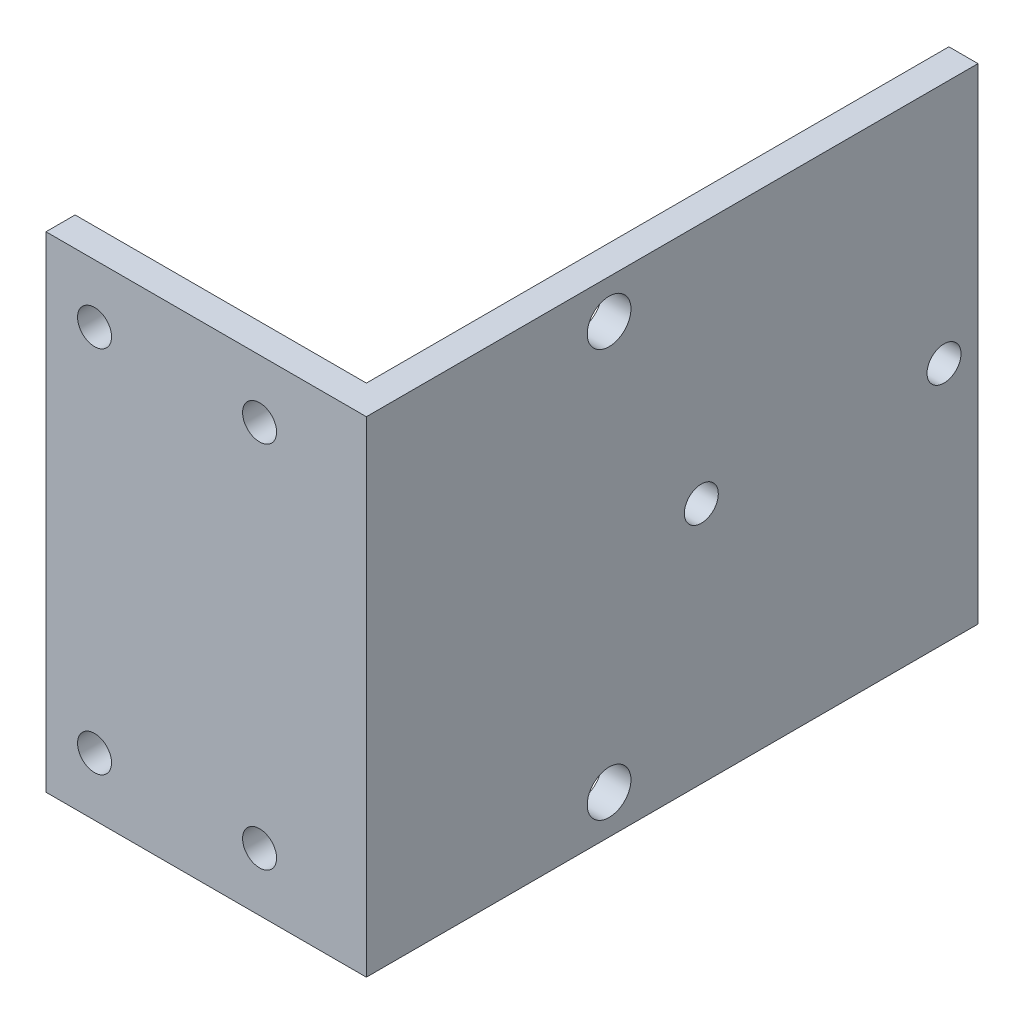
ISO-10303-21;
HEADER;
FILE_DESCRIPTION(('STEP AP214'),'2;1');
FILE_NAME('part.step','',(''),(''),'','','');
FILE_SCHEMA(('AUTOMOTIVE_DESIGN { 1 0 10303 214 1 1 1 1 }'));
ENDSEC;
DATA;
#1=APPLICATION_CONTEXT('core data for automotive mechanical design processes');
#2=APPLICATION_PROTOCOL_DEFINITION('international standard','automotive_design',2000,#1);
#3=PRODUCT_CONTEXT('',#1,'mechanical');
#4=PRODUCT('Part','Part','',(#3));
#5=PRODUCT_RELATED_PRODUCT_CATEGORY('part','',(#4));
#6=PRODUCT_DEFINITION_FORMATION('','',#4);
#7=PRODUCT_DEFINITION_CONTEXT('part definition',#1,'design');
#8=PRODUCT_DEFINITION('design','',#6,#7);
#9=PRODUCT_DEFINITION_SHAPE('','',#8);
#10=(LENGTH_UNIT() NAMED_UNIT(*) SI_UNIT(.MILLI.,.METRE.));
#11=(NAMED_UNIT(*) PLANE_ANGLE_UNIT() SI_UNIT($,.RADIAN.));
#12=(NAMED_UNIT(*) SI_UNIT($,.STERADIAN.) SOLID_ANGLE_UNIT());
#13=UNCERTAINTY_MEASURE_WITH_UNIT(LENGTH_MEASURE(1.E-05),#10,'distance_accuracy_value','');
#14=(GEOMETRIC_REPRESENTATION_CONTEXT(3) GLOBAL_UNCERTAINTY_ASSIGNED_CONTEXT((#13)) GLOBAL_UNIT_ASSIGNED_CONTEXT((#10,
#11,#12)) REPRESENTATION_CONTEXT('',''));
#15=CARTESIAN_POINT('',(0.,0.,0.));
#16=DIRECTION('',(0.,0.,1.));
#17=DIRECTION('',(1.,0.,0.));
#18=AXIS2_PLACEMENT_3D('',#15,#16,#17);
#19=CARTESIAN_POINT('',(0.,50.,3.));
#20=DIRECTION('',(1.,0.,0.));
#21=DIRECTION('',(0.,0.,-1.));
#22=AXIS2_PLACEMENT_3D('',#19,#20,#21);
#23=PLANE('',#22);
#24=DIRECTION('',(0.,0.,1.));
#25=VECTOR('',#24,1.);
#26=CARTESIAN_POINT('',(0.,0.,3.));
#27=LINE('',#26,#25);
#28=CARTESIAN_POINT('',(0.,0.,0.));
#29=VERTEX_POINT('',#28);
#30=CARTESIAN_POINT('',(0.,0.,3.));
#31=VERTEX_POINT('',#30);
#32=EDGE_CURVE('E119',#29,#31,#27,.T.);
#33=ORIENTED_EDGE('',*,*,#32,.T.);
#34=DIRECTION('',(0.,-1.,0.));
#35=VECTOR('',#34,1.);
#36=CARTESIAN_POINT('',(0.,50.,3.));
#37=LINE('',#36,#35);
#38=CARTESIAN_POINT('',(0.,50.,3.));
#39=VERTEX_POINT('',#38);
#40=EDGE_CURVE('E11',#39,#31,#37,.T.);
#41=ORIENTED_EDGE('',*,*,#40,.F.);
#42=DIRECTION('',(0.,0.,1.));
#43=VECTOR('',#42,1.);
#44=CARTESIAN_POINT('',(0.,50.,3.));
#45=LINE('',#44,#43);
#46=CARTESIAN_POINT('',(0.,50.,0.));
#47=VERTEX_POINT('',#46);
#48=EDGE_CURVE('E130',#47,#39,#45,.T.);
#49=ORIENTED_EDGE('',*,*,#48,.F.);
#50=DIRECTION('',(0.,-1.,0.));
#51=VECTOR('',#50,1.);
#52=CARTESIAN_POINT('',(0.,50.,0.));
#53=LINE('',#52,#51);
#54=EDGE_CURVE('E115',#47,#29,#53,.T.);
#55=ORIENTED_EDGE('',*,*,#54,.T.);
#56=EDGE_LOOP('',(#33,#41,#49,#55));
#57=FACE_BOUND('',#56,.T.);
#58=ADVANCED_FACE('F35',(#57),#23,.F.);
#59=CARTESIAN_POINT('',(0.,50.,3.));
#60=DIRECTION('',(0.,0.,-1.));
#61=DIRECTION('',(-1.,0.,0.));
#62=AXIS2_PLACEMENT_3D('',#59,#60,#61);
#63=PLANE('',#62);
#64=CARTESIAN_POINT('',(5.,6.,3.));
#65=DIRECTION('',(0.,0.,-1.));
#66=DIRECTION('',(-1.,0.,0.));
#67=AXIS2_PLACEMENT_3D('',#64,#65,#66);
#68=CIRCLE('',#67,1.75);
#69=CARTESIAN_POINT('',(3.25,6.,3.));
#70=VERTEX_POINT('',#69);
#71=EDGE_CURVE('E319',#70,#70,#68,.T.);
#72=ORIENTED_EDGE('',*,*,#71,.T.);
#73=EDGE_LOOP('',(#72));
#74=FACE_BOUND('',#73,.T.);
#75=CARTESIAN_POINT('',(5.,44.,3.));
#76=DIRECTION('',(0.,0.,-1.));
#77=DIRECTION('',(-1.,0.,0.));
#78=AXIS2_PLACEMENT_3D('',#75,#76,#77);
#79=CIRCLE('',#78,1.75);
#80=CARTESIAN_POINT('',(3.25,44.,3.));
#81=VERTEX_POINT('',#80);
#82=EDGE_CURVE('E314',#81,#81,#79,.T.);
#83=ORIENTED_EDGE('',*,*,#82,.T.);
#84=EDGE_LOOP('',(#83));
#85=FACE_BOUND('',#84,.T.);
#86=CARTESIAN_POINT('',(22.,44.,3.));
#87=DIRECTION('',(0.,0.,-1.));
#88=DIRECTION('',(-1.,0.,0.));
#89=AXIS2_PLACEMENT_3D('',#86,#87,#88);
#90=CIRCLE('',#89,1.75);
#91=CARTESIAN_POINT('',(20.25,44.,3.));
#92=VERTEX_POINT('',#91);
#93=EDGE_CURVE('E304',#92,#92,#90,.T.);
#94=ORIENTED_EDGE('',*,*,#93,.T.);
#95=EDGE_LOOP('',(#94));
#96=FACE_BOUND('',#95,.T.);
#97=CARTESIAN_POINT('',(22.,6.,3.));
#98=DIRECTION('',(0.,0.,-1.));
#99=DIRECTION('',(-1.,0.,0.));
#100=AXIS2_PLACEMENT_3D('',#97,#98,#99);
#101=CIRCLE('',#100,1.75);
#102=CARTESIAN_POINT('',(20.25,6.,3.));
#103=VERTEX_POINT('',#102);
#104=EDGE_CURVE('E123',#103,#103,#101,.T.);
#105=ORIENTED_EDGE('',*,*,#104,.T.);
#106=EDGE_LOOP('',(#105));
#107=FACE_BOUND('',#106,.T.);
#108=DIRECTION('',(1.,0.,0.));
#109=VECTOR('',#108,1.);
#110=CARTESIAN_POINT('',(0.,0.,3.));
#111=LINE('',#110,#109);
#112=CARTESIAN_POINT('',(33.,0.,3.));
#113=VERTEX_POINT('',#112);
#114=EDGE_CURVE('E122',#31,#113,#111,.T.);
#115=ORIENTED_EDGE('',*,*,#114,.T.);
#116=DIRECTION('',(0.,-1.,0.));
#117=VECTOR('',#116,1.);
#118=CARTESIAN_POINT('',(33.,50.,3.));
#119=LINE('',#118,#117);
#120=CARTESIAN_POINT('',(33.,50.,3.));
#121=VERTEX_POINT('',#120);
#122=EDGE_CURVE('E43',#121,#113,#119,.T.);
#123=ORIENTED_EDGE('',*,*,#122,.F.);
#124=DIRECTION('',(1.,0.,0.));
#125=VECTOR('',#124,1.);
#126=CARTESIAN_POINT('',(0.,50.,3.));
#127=LINE('',#126,#125);
#128=EDGE_CURVE('E88',#39,#121,#127,.T.);
#129=ORIENTED_EDGE('',*,*,#128,.F.);
#130=ORIENTED_EDGE('',*,*,#40,.T.);
#131=EDGE_LOOP('',(#115,#123,#129,#130));
#132=FACE_BOUND('',#131,.T.);
#133=ADVANCED_FACE('F159',(#74,#85,#96,#107,#132),#63,.F.);
#134=CARTESIAN_POINT('',(33.,50.,3.));
#135=DIRECTION('',(-1.,0.,0.));
#136=DIRECTION('',(0.,0.,1.));
#137=AXIS2_PLACEMENT_3D('',#134,#135,#136);
#138=PLANE('',#137);
#139=CARTESIAN_POINT('',(33.,4.,-22.));
#140=DIRECTION('',(1.,0.,0.));
#141=DIRECTION('',(0.,0.,-1.));
#142=AXIS2_PLACEMENT_3D('',#139,#140,#141);
#143=CIRCLE('',#142,2.25);
#144=CARTESIAN_POINT('',(33.,4.,-24.25));
#145=VERTEX_POINT('',#144);
#146=EDGE_CURVE('E347',#145,#145,#143,.T.);
#147=ORIENTED_EDGE('',*,*,#146,.F.);
#148=EDGE_LOOP('',(#147));
#149=FACE_BOUND('',#148,.T.);
#150=CARTESIAN_POINT('',(33.,46.,-22.));
#151=DIRECTION('',(1.,0.,0.));
#152=DIRECTION('',(0.,0.,-1.));
#153=AXIS2_PLACEMENT_3D('',#150,#151,#152);
#154=CIRCLE('',#153,2.25);
#155=CARTESIAN_POINT('',(33.,46.,-24.25));
#156=VERTEX_POINT('',#155);
#157=EDGE_CURVE('E341',#156,#156,#154,.T.);
#158=ORIENTED_EDGE('',*,*,#157,.F.);
#159=EDGE_LOOP('',(#158));
#160=FACE_BOUND('',#159,.T.);
#161=CARTESIAN_POINT('',(33.,25.,-31.5));
#162=DIRECTION('',(1.,0.,0.));
#163=DIRECTION('',(0.,0.,-1.));
#164=AXIS2_PLACEMENT_3D('',#161,#162,#163);
#165=CIRCLE('',#164,1.75);
#166=CARTESIAN_POINT('',(33.,25.,-33.25));
#167=VERTEX_POINT('',#166);
#168=EDGE_CURVE('E335',#167,#167,#165,.T.);
#169=ORIENTED_EDGE('',*,*,#168,.F.);
#170=EDGE_LOOP('',(#169));
#171=FACE_BOUND('',#170,.T.);
#172=CARTESIAN_POINT('',(33.,25.,-56.5));
#173=DIRECTION('',(1.,0.,0.));
#174=DIRECTION('',(0.,0.,-1.));
#175=AXIS2_PLACEMENT_3D('',#172,#173,#174);
#176=CIRCLE('',#175,1.75);
#177=CARTESIAN_POINT('',(33.,25.,-58.25));
#178=VERTEX_POINT('',#177);
#179=EDGE_CURVE('E329',#178,#178,#176,.T.);
#180=ORIENTED_EDGE('',*,*,#179,.F.);
#181=EDGE_LOOP('',(#180));
#182=FACE_BOUND('',#181,.T.);
#183=DIRECTION('',(0.,0.,-1.));
#184=VECTOR('',#183,1.);
#185=CARTESIAN_POINT('',(33.,0.,3.));
#186=LINE('',#185,#184);
#187=CARTESIAN_POINT('',(33.,0.,-60.));
#188=VERTEX_POINT('',#187);
#189=EDGE_CURVE('E125',#113,#188,#186,.T.);
#190=ORIENTED_EDGE('',*,*,#189,.T.);
#191=DIRECTION('',(0.,-1.,0.));
#192=VECTOR('',#191,1.);
#193=CARTESIAN_POINT('',(33.,50.,-60.));
#194=LINE('',#193,#192);
#195=CARTESIAN_POINT('',(33.,50.,-60.));
#196=VERTEX_POINT('',#195);
#197=EDGE_CURVE('E110',#196,#188,#194,.T.);
#198=ORIENTED_EDGE('',*,*,#197,.F.);
#199=DIRECTION('',(0.,0.,-1.));
#200=VECTOR('',#199,1.);
#201=CARTESIAN_POINT('',(33.,50.,3.));
#202=LINE('',#201,#200);
#203=EDGE_CURVE('E101',#121,#196,#202,.T.);
#204=ORIENTED_EDGE('',*,*,#203,.F.);
#205=ORIENTED_EDGE('',*,*,#122,.T.);
#206=EDGE_LOOP('',(#190,#198,#204,#205));
#207=FACE_BOUND('',#206,.T.);
#208=ADVANCED_FACE('F136',(#149,#160,#171,#182,#207),#138,.F.);
#209=CARTESIAN_POINT('',(30.,50.,-60.));
#210=DIRECTION('',(0.,0.,1.));
#211=DIRECTION('',(1.,0.,0.));
#212=AXIS2_PLACEMENT_3D('',#209,#210,#211);
#213=PLANE('',#212);
#214=DIRECTION('',(-1.,0.,0.));
#215=VECTOR('',#214,1.);
#216=CARTESIAN_POINT('',(30.,0.,-60.));
#217=LINE('',#216,#215);
#218=CARTESIAN_POINT('',(30.,0.,-60.));
#219=VERTEX_POINT('',#218);
#220=EDGE_CURVE('E109',#188,#219,#217,.T.);
#221=ORIENTED_EDGE('',*,*,#220,.T.);
#222=DIRECTION('',(0.,-1.,0.));
#223=VECTOR('',#222,1.);
#224=CARTESIAN_POINT('',(30.,50.,-60.));
#225=LINE('',#224,#223);
#226=CARTESIAN_POINT('',(30.,50.,-60.));
#227=VERTEX_POINT('',#226);
#228=EDGE_CURVE('E106',#227,#219,#225,.T.);
#229=ORIENTED_EDGE('',*,*,#228,.F.);
#230=DIRECTION('',(-1.,0.,0.));
#231=VECTOR('',#230,1.);
#232=CARTESIAN_POINT('',(30.,50.,-60.));
#233=LINE('',#232,#231);
#234=EDGE_CURVE('E95',#196,#227,#233,.T.);
#235=ORIENTED_EDGE('',*,*,#234,.F.);
#236=ORIENTED_EDGE('',*,*,#197,.T.);
#237=EDGE_LOOP('',(#221,#229,#235,#236));
#238=FACE_BOUND('',#237,.T.);
#239=ADVANCED_FACE('F107',(#238),#213,.F.);
#240=CARTESIAN_POINT('',(30.,50.,0.));
#241=DIRECTION('',(1.,0.,0.));
#242=DIRECTION('',(0.,0.,-1.));
#243=AXIS2_PLACEMENT_3D('',#240,#241,#242);
#244=PLANE('',#243);
#245=CARTESIAN_POINT('',(30.,4.,-22.));
#246=DIRECTION('',(1.,0.,0.));
#247=DIRECTION('',(0.,0.,-1.));
#248=AXIS2_PLACEMENT_3D('',#245,#246,#247);
#249=CIRCLE('',#248,2.25);
#250=CARTESIAN_POINT('',(30.,4.,-24.25));
#251=VERTEX_POINT('',#250);
#252=EDGE_CURVE('E344',#251,#251,#249,.F.);
#253=ORIENTED_EDGE('',*,*,#252,.F.);
#254=EDGE_LOOP('',(#253));
#255=FACE_BOUND('',#254,.T.);
#256=CARTESIAN_POINT('',(30.,46.,-22.));
#257=DIRECTION('',(1.,0.,0.));
#258=DIRECTION('',(0.,0.,-1.));
#259=AXIS2_PLACEMENT_3D('',#256,#257,#258);
#260=CIRCLE('',#259,2.25);
#261=CARTESIAN_POINT('',(30.,46.,-24.25));
#262=VERTEX_POINT('',#261);
#263=EDGE_CURVE('E338',#262,#262,#260,.F.);
#264=ORIENTED_EDGE('',*,*,#263,.F.);
#265=EDGE_LOOP('',(#264));
#266=FACE_BOUND('',#265,.T.);
#267=CARTESIAN_POINT('',(30.,25.,-31.5));
#268=DIRECTION('',(1.,0.,0.));
#269=DIRECTION('',(0.,0.,-1.));
#270=AXIS2_PLACEMENT_3D('',#267,#268,#269);
#271=CIRCLE('',#270,1.75);
#272=CARTESIAN_POINT('',(30.,25.,-33.25));
#273=VERTEX_POINT('',#272);
#274=EDGE_CURVE('E332',#273,#273,#271,.F.);
#275=ORIENTED_EDGE('',*,*,#274,.F.);
#276=EDGE_LOOP('',(#275));
#277=FACE_BOUND('',#276,.T.);
#278=CARTESIAN_POINT('',(30.,25.,-56.5));
#279=DIRECTION('',(1.,0.,0.));
#280=DIRECTION('',(0.,0.,-1.));
#281=AXIS2_PLACEMENT_3D('',#278,#279,#280);
#282=CIRCLE('',#281,1.75);
#283=CARTESIAN_POINT('',(30.,25.,-58.25));
#284=VERTEX_POINT('',#283);
#285=EDGE_CURVE('E325',#284,#284,#282,.F.);
#286=ORIENTED_EDGE('',*,*,#285,.F.);
#287=EDGE_LOOP('',(#286));
#288=FACE_BOUND('',#287,.T.);
#289=DIRECTION('',(0.,0.,1.));
#290=VECTOR('',#289,1.);
#291=CARTESIAN_POINT('',(30.,0.,0.));
#292=LINE('',#291,#290);
#293=CARTESIAN_POINT('',(30.,0.,0.));
#294=VERTEX_POINT('',#293);
#295=EDGE_CURVE('E74',#219,#294,#292,.T.);
#296=ORIENTED_EDGE('',*,*,#295,.T.);
#297=DIRECTION('',(0.,-1.,0.));
#298=VECTOR('',#297,1.);
#299=CARTESIAN_POINT('',(30.,50.,0.));
#300=LINE('',#299,#298);
#301=CARTESIAN_POINT('',(30.,50.,0.));
#302=VERTEX_POINT('',#301);
#303=EDGE_CURVE('E111',#302,#294,#300,.T.);
#304=ORIENTED_EDGE('',*,*,#303,.F.);
#305=DIRECTION('',(0.,0.,1.));
#306=VECTOR('',#305,1.);
#307=CARTESIAN_POINT('',(30.,50.,0.));
#308=LINE('',#307,#306);
#309=EDGE_CURVE('E99',#227,#302,#308,.T.);
#310=ORIENTED_EDGE('',*,*,#309,.F.);
#311=ORIENTED_EDGE('',*,*,#228,.T.);
#312=EDGE_LOOP('',(#296,#304,#310,#311));
#313=FACE_BOUND('',#312,.T.);
#314=ADVANCED_FACE('F113',(#255,#266,#277,#288,#313),#244,.F.);
#315=CARTESIAN_POINT('',(0.,50.,0.));
#316=DIRECTION('',(0.,0.,1.));
#317=DIRECTION('',(1.,0.,0.));
#318=AXIS2_PLACEMENT_3D('',#315,#316,#317);
#319=PLANE('',#318);
#320=CARTESIAN_POINT('',(5.,6.,0.));
#321=DIRECTION('',(0.,0.,-1.));
#322=DIRECTION('',(-1.,0.,0.));
#323=AXIS2_PLACEMENT_3D('',#320,#321,#322);
#324=CIRCLE('',#323,1.75);
#325=CARTESIAN_POINT('',(3.25,6.,0.));
#326=VERTEX_POINT('',#325);
#327=EDGE_CURVE('E322',#326,#326,#324,.T.);
#328=ORIENTED_EDGE('',*,*,#327,.F.);
#329=EDGE_LOOP('',(#328));
#330=FACE_BOUND('',#329,.T.);
#331=CARTESIAN_POINT('',(5.,44.,0.));
#332=DIRECTION('',(0.,0.,-1.));
#333=DIRECTION('',(-1.,0.,0.));
#334=AXIS2_PLACEMENT_3D('',#331,#332,#333);
#335=CIRCLE('',#334,1.75);
#336=CARTESIAN_POINT('',(3.25,44.,0.));
#337=VERTEX_POINT('',#336);
#338=EDGE_CURVE('E316',#337,#337,#335,.T.);
#339=ORIENTED_EDGE('',*,*,#338,.F.);
#340=EDGE_LOOP('',(#339));
#341=FACE_BOUND('',#340,.T.);
#342=CARTESIAN_POINT('',(22.,44.,0.));
#343=DIRECTION('',(0.,0.,-1.));
#344=DIRECTION('',(-1.,0.,0.));
#345=AXIS2_PLACEMENT_3D('',#342,#343,#344);
#346=CIRCLE('',#345,1.75);
#347=CARTESIAN_POINT('',(20.25,44.,0.));
#348=VERTEX_POINT('',#347);
#349=EDGE_CURVE('E308',#348,#348,#346,.T.);
#350=ORIENTED_EDGE('',*,*,#349,.F.);
#351=EDGE_LOOP('',(#350));
#352=FACE_BOUND('',#351,.T.);
#353=CARTESIAN_POINT('',(22.,6.,0.));
#354=DIRECTION('',(0.,0.,-1.));
#355=DIRECTION('',(-1.,0.,0.));
#356=AXIS2_PLACEMENT_3D('',#353,#354,#355);
#357=CIRCLE('',#356,1.75);
#358=CARTESIAN_POINT('',(20.25,6.,0.));
#359=VERTEX_POINT('',#358);
#360=EDGE_CURVE('E302',#359,#359,#357,.T.);
#361=ORIENTED_EDGE('',*,*,#360,.F.);
#362=EDGE_LOOP('',(#361));
#363=FACE_BOUND('',#362,.T.);
#364=DIRECTION('',(-1.,0.,0.));
#365=VECTOR('',#364,1.);
#366=CARTESIAN_POINT('',(0.,0.,0.));
#367=LINE('',#366,#365);
#368=EDGE_CURVE('E80',#294,#29,#367,.T.);
#369=ORIENTED_EDGE('',*,*,#368,.T.);
#370=ORIENTED_EDGE('',*,*,#54,.F.);
#371=DIRECTION('',(-1.,0.,0.));
#372=VECTOR('',#371,1.);
#373=CARTESIAN_POINT('',(0.,50.,0.));
#374=LINE('',#373,#372);
#375=EDGE_CURVE('E51',#302,#47,#374,.T.);
#376=ORIENTED_EDGE('',*,*,#375,.F.);
#377=ORIENTED_EDGE('',*,*,#303,.T.);
#378=EDGE_LOOP('',(#369,#370,#376,#377));
#379=FACE_BOUND('',#378,.T.);
#380=ADVANCED_FACE('F143',(#330,#341,#352,#363,#379),#319,.F.);
#381=CARTESIAN_POINT('',(0.,50.,0.));
#382=DIRECTION('',(0.,-1.,0.));
#383=DIRECTION('',(0.,0.,-1.));
#384=AXIS2_PLACEMENT_3D('',#381,#382,#383);
#385=PLANE('',#384);
#386=ORIENTED_EDGE('',*,*,#48,.T.);
#387=ORIENTED_EDGE('',*,*,#128,.T.);
#388=ORIENTED_EDGE('',*,*,#203,.T.);
#389=ORIENTED_EDGE('',*,*,#234,.T.);
#390=ORIENTED_EDGE('',*,*,#309,.T.);
#391=ORIENTED_EDGE('',*,*,#375,.T.);
#392=EDGE_LOOP('',(#386,#387,#388,#389,#390,#391));
#393=FACE_BOUND('',#392,.T.);
#394=ADVANCED_FACE('F97',(#393),#385,.F.);
#395=CARTESIAN_POINT('',(0.,0.,0.));
#396=DIRECTION('',(0.,-1.,0.));
#397=DIRECTION('',(0.,0.,-1.));
#398=AXIS2_PLACEMENT_3D('',#395,#396,#397);
#399=PLANE('',#398);
#400=ORIENTED_EDGE('',*,*,#32,.F.);
#401=ORIENTED_EDGE('',*,*,#368,.F.);
#402=ORIENTED_EDGE('',*,*,#295,.F.);
#403=ORIENTED_EDGE('',*,*,#220,.F.);
#404=ORIENTED_EDGE('',*,*,#189,.F.);
#405=ORIENTED_EDGE('',*,*,#114,.F.);
#406=EDGE_LOOP('',(#400,#401,#402,#403,#404,#405));
#407=FACE_BOUND('',#406,.T.);
#408=ADVANCED_FACE('F139',(#407),#399,.T.);
#409=CARTESIAN_POINT('',(22.,6.,3.));
#410=DIRECTION('',(0.,0.,-1.));
#411=DIRECTION('',(-1.,0.,0.));
#412=AXIS2_PLACEMENT_3D('',#409,#410,#411);
#413=CYLINDRICAL_SURFACE('',#412,1.75);
#414=ORIENTED_EDGE('',*,*,#104,.F.);
#415=EDGE_LOOP('',(#414));
#416=FACE_BOUND('',#415,.T.);
#417=ORIENTED_EDGE('',*,*,#360,.T.);
#418=EDGE_LOOP('',(#417));
#419=FACE_BOUND('',#418,.T.);
#420=ADVANCED_FACE('F244',(#416,#419),#413,.F.);
#421=CARTESIAN_POINT('',(22.,44.,3.));
#422=DIRECTION('',(0.,0.,-1.));
#423=DIRECTION('',(-1.,0.,0.));
#424=AXIS2_PLACEMENT_3D('',#421,#422,#423);
#425=CYLINDRICAL_SURFACE('',#424,1.75);
#426=ORIENTED_EDGE('',*,*,#93,.F.);
#427=EDGE_LOOP('',(#426));
#428=FACE_BOUND('',#427,.T.);
#429=ORIENTED_EDGE('',*,*,#349,.T.);
#430=EDGE_LOOP('',(#429));
#431=FACE_BOUND('',#430,.T.);
#432=ADVANCED_FACE('F240',(#428,#431),#425,.F.);
#433=CARTESIAN_POINT('',(5.,44.,3.));
#434=DIRECTION('',(0.,0.,-1.));
#435=DIRECTION('',(-1.,0.,0.));
#436=AXIS2_PLACEMENT_3D('',#433,#434,#435);
#437=CYLINDRICAL_SURFACE('',#436,1.75);
#438=ORIENTED_EDGE('',*,*,#82,.F.);
#439=EDGE_LOOP('',(#438));
#440=FACE_BOUND('',#439,.T.);
#441=ORIENTED_EDGE('',*,*,#338,.T.);
#442=EDGE_LOOP('',(#441));
#443=FACE_BOUND('',#442,.T.);
#444=ADVANCED_FACE('F236',(#440,#443),#437,.F.);
#445=CARTESIAN_POINT('',(5.,6.,3.));
#446=DIRECTION('',(0.,0.,-1.));
#447=DIRECTION('',(-1.,0.,0.));
#448=AXIS2_PLACEMENT_3D('',#445,#446,#447);
#449=CYLINDRICAL_SURFACE('',#448,1.75);
#450=ORIENTED_EDGE('',*,*,#71,.F.);
#451=EDGE_LOOP('',(#450));
#452=FACE_BOUND('',#451,.T.);
#453=ORIENTED_EDGE('',*,*,#327,.T.);
#454=EDGE_LOOP('',(#453));
#455=FACE_BOUND('',#454,.T.);
#456=ADVANCED_FACE('F196',(#452,#455),#449,.F.);
#457=CARTESIAN_POINT('',(-0.00100000000001488,25.,-56.5));
#458=DIRECTION('',(1.,0.,0.));
#459=DIRECTION('',(0.,0.,-1.));
#460=AXIS2_PLACEMENT_3D('',#457,#458,#459);
#461=CYLINDRICAL_SURFACE('',#460,1.75);
#462=ORIENTED_EDGE('',*,*,#179,.T.);
#463=EDGE_LOOP('',(#462));
#464=FACE_BOUND('',#463,.T.);
#465=ORIENTED_EDGE('',*,*,#285,.T.);
#466=EDGE_LOOP('',(#465));
#467=FACE_BOUND('',#466,.T.);
#468=ADVANCED_FACE('F190',(#464,#467),#461,.F.);
#469=CARTESIAN_POINT('',(-0.00100000000000794,25.,-31.5));
#470=DIRECTION('',(1.,0.,0.));
#471=DIRECTION('',(0.,0.,-1.));
#472=AXIS2_PLACEMENT_3D('',#469,#470,#471);
#473=CYLINDRICAL_SURFACE('',#472,1.75);
#474=ORIENTED_EDGE('',*,*,#168,.T.);
#475=EDGE_LOOP('',(#474));
#476=FACE_BOUND('',#475,.T.);
#477=ORIENTED_EDGE('',*,*,#274,.T.);
#478=EDGE_LOOP('',(#477));
#479=FACE_BOUND('',#478,.T.);
#480=ADVANCED_FACE('F195',(#476,#479),#473,.F.);
#481=CARTESIAN_POINT('',(-0.00100000000000794,46.,-22.));
#482=DIRECTION('',(1.,0.,0.));
#483=DIRECTION('',(0.,0.,-1.));
#484=AXIS2_PLACEMENT_3D('',#481,#482,#483);
#485=CYLINDRICAL_SURFACE('',#484,2.25);
#486=ORIENTED_EDGE('',*,*,#157,.T.);
#487=EDGE_LOOP('',(#486));
#488=FACE_BOUND('',#487,.T.);
#489=ORIENTED_EDGE('',*,*,#263,.T.);
#490=EDGE_LOOP('',(#489));
#491=FACE_BOUND('',#490,.T.);
#492=ADVANCED_FACE('F208',(#488,#491),#485,.F.);
#493=CARTESIAN_POINT('',(-0.00100000000000794,4.,-22.));
#494=DIRECTION('',(1.,0.,0.));
#495=DIRECTION('',(0.,0.,-1.));
#496=AXIS2_PLACEMENT_3D('',#493,#494,#495);
#497=CYLINDRICAL_SURFACE('',#496,2.25);
#498=ORIENTED_EDGE('',*,*,#146,.T.);
#499=EDGE_LOOP('',(#498));
#500=FACE_BOUND('',#499,.T.);
#501=ORIENTED_EDGE('',*,*,#252,.T.);
#502=EDGE_LOOP('',(#501));
#503=FACE_BOUND('',#502,.T.);
#504=ADVANCED_FACE('F218',(#500,#503),#497,.F.);
#505=CLOSED_SHELL('',(#58,#133,#208,#239,#314,#380,#394,#408,#420,#432,#444,#456,#468,#480,#492,#504));
#506=MANIFOLD_SOLID_BREP('B2',#505);
#507=ADVANCED_BREP_SHAPE_REPRESENTATION('',(#18,#506),#14);
#508=SHAPE_DEFINITION_REPRESENTATION(#9,#507);
ENDSEC;
END-ISO-10303-21;
